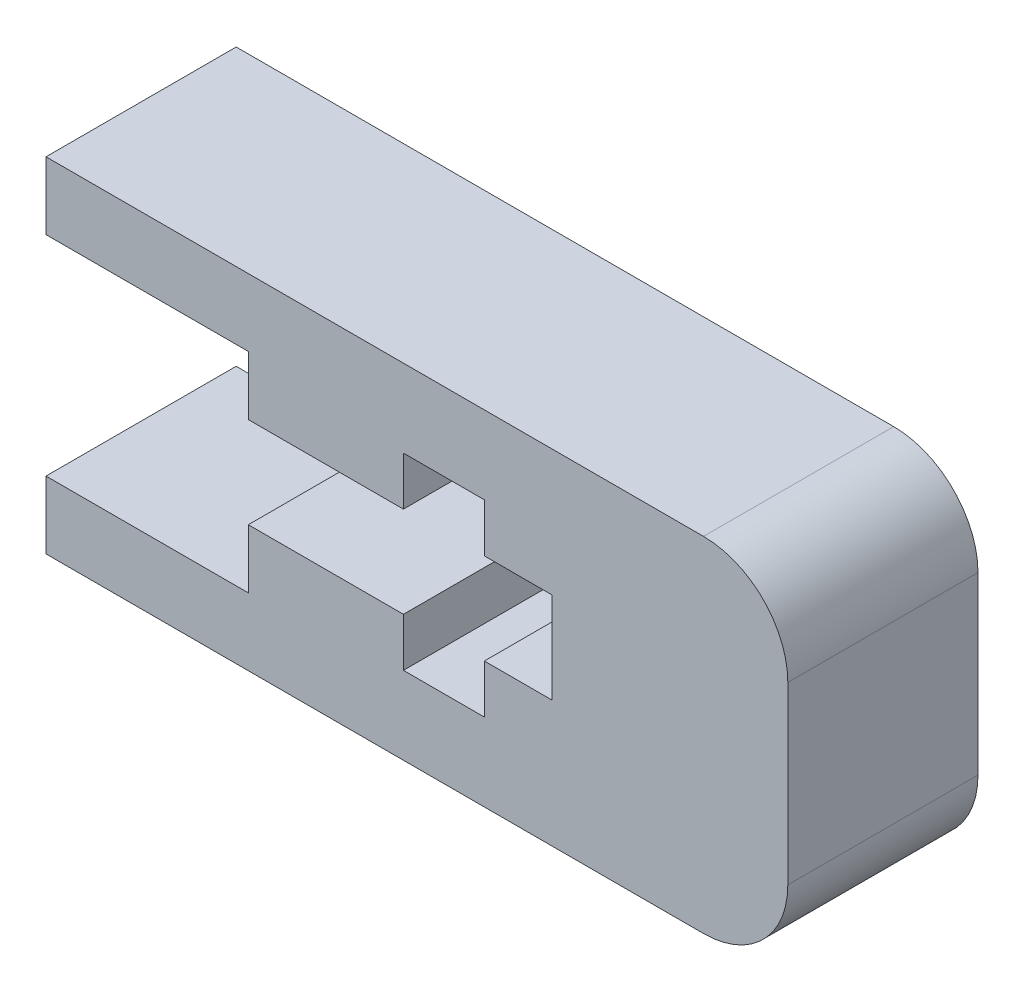
ISO-10303-21;
HEADER;
FILE_DESCRIPTION(('STEP AP214'),'2;1');
FILE_NAME('part.step','',(''),(''),'','','');
FILE_SCHEMA(('AUTOMOTIVE_DESIGN { 1 0 10303 214 1 1 1 1 }'));
ENDSEC;
DATA;
#1=APPLICATION_CONTEXT('core data for automotive mechanical design processes');
#2=APPLICATION_PROTOCOL_DEFINITION('international standard','automotive_design',2000,#1);
#3=PRODUCT_CONTEXT('',#1,'mechanical');
#4=PRODUCT('Part','Part','',(#3));
#5=PRODUCT_RELATED_PRODUCT_CATEGORY('part','',(#4));
#6=PRODUCT_DEFINITION_FORMATION('','',#4);
#7=PRODUCT_DEFINITION_CONTEXT('part definition',#1,'design');
#8=PRODUCT_DEFINITION('design','',#6,#7);
#9=PRODUCT_DEFINITION_SHAPE('','',#8);
#10=(LENGTH_UNIT() NAMED_UNIT(*) SI_UNIT(.MILLI.,.METRE.));
#11=(NAMED_UNIT(*) PLANE_ANGLE_UNIT() SI_UNIT($,.RADIAN.));
#12=(NAMED_UNIT(*) SI_UNIT($,.STERADIAN.) SOLID_ANGLE_UNIT());
#13=UNCERTAINTY_MEASURE_WITH_UNIT(LENGTH_MEASURE(1.E-05),#10,'distance_accuracy_value','');
#14=(GEOMETRIC_REPRESENTATION_CONTEXT(3) GLOBAL_UNCERTAINTY_ASSIGNED_CONTEXT((#13)) GLOBAL_UNIT_ASSIGNED_CONTEXT((#10,
#11,#12)) REPRESENTATION_CONTEXT('',''));
#15=CARTESIAN_POINT('',(0.,0.,0.));
#16=DIRECTION('',(0.,0.,1.));
#17=DIRECTION('',(1.,0.,0.));
#18=AXIS2_PLACEMENT_3D('',#15,#16,#17);
#19=CARTESIAN_POINT('',(733.339448149884,348.756300381642,5.64));
#20=DIRECTION('',(1.,0.,0.));
#21=DIRECTION('',(0.,0.,-1.));
#22=AXIS2_PLACEMENT_3D('',#19,#20,#21);
#23=PLANE('',#22);
#24=DIRECTION('',(0.,-1.,0.));
#25=VECTOR('',#24,1.);
#26=CARTESIAN_POINT('',(733.339448149884,348.756300381642,0.));
#27=LINE('',#26,#25);
#28=CARTESIAN_POINT('',(733.339448149884,348.756300381642,0.));
#29=VERTEX_POINT('',#28);
#30=CARTESIAN_POINT('',(733.339448149884,347.006300381642,0.));
#31=VERTEX_POINT('',#30);
#32=EDGE_CURVE('E206',#29,#31,#27,.T.);
#33=ORIENTED_EDGE('',*,*,#32,.T.);
#34=DIRECTION('',(0.,0.,-1.));
#35=VECTOR('',#34,1.);
#36=CARTESIAN_POINT('',(733.339448149884,347.006300381642,5.64));
#37=LINE('',#36,#35);
#38=CARTESIAN_POINT('',(733.339448149884,347.006300381642,5.64));
#39=VERTEX_POINT('',#38);
#40=EDGE_CURVE('E188',#39,#31,#37,.T.);
#41=ORIENTED_EDGE('',*,*,#40,.F.);
#42=DIRECTION('',(0.,-1.,0.));
#43=VECTOR('',#42,1.);
#44=CARTESIAN_POINT('',(733.339448149884,348.756300381642,5.64));
#45=LINE('',#44,#43);
#46=CARTESIAN_POINT('',(733.339448149884,348.756300381642,5.64));
#47=VERTEX_POINT('',#46);
#48=EDGE_CURVE('E194',#47,#39,#45,.T.);
#49=ORIENTED_EDGE('',*,*,#48,.F.);
#50=DIRECTION('',(0.,0.,-1.));
#51=VECTOR('',#50,1.);
#52=CARTESIAN_POINT('',(733.339448149884,348.756300381642,5.64));
#53=LINE('',#52,#51);
#54=EDGE_CURVE('E258',#47,#29,#53,.T.);
#55=ORIENTED_EDGE('',*,*,#54,.T.);
#56=EDGE_LOOP('',(#33,#41,#49,#55));
#57=FACE_BOUND('',#56,.T.);
#58=ADVANCED_FACE('F32',(#57),#23,.F.);
#59=CARTESIAN_POINT('',(733.339448149884,347.006300381642,5.64));
#60=DIRECTION('',(0.,1.,0.));
#61=DIRECTION('',(0.,0.,1.));
#62=AXIS2_PLACEMENT_3D('',#59,#60,#61);
#63=PLANE('',#62);
#64=DIRECTION('',(1.,0.,0.));
#65=VECTOR('',#64,1.);
#66=CARTESIAN_POINT('',(733.339448149884,347.006300381642,0.));
#67=LINE('',#66,#65);
#68=CARTESIAN_POINT('',(737.939448149884,347.006300381642,0.));
#69=VERTEX_POINT('',#68);
#70=EDGE_CURVE('E317',#31,#69,#67,.T.);
#71=ORIENTED_EDGE('',*,*,#70,.T.);
#72=DIRECTION('',(0.,0.,-1.));
#73=VECTOR('',#72,1.);
#74=CARTESIAN_POINT('',(737.939448149884,347.006300381642,5.64));
#75=LINE('',#74,#73);
#76=CARTESIAN_POINT('',(737.939448149884,347.006300381642,5.64));
#77=VERTEX_POINT('',#76);
#78=EDGE_CURVE('E191',#77,#69,#75,.T.);
#79=ORIENTED_EDGE('',*,*,#78,.F.);
#80=DIRECTION('',(1.,0.,0.));
#81=VECTOR('',#80,1.);
#82=CARTESIAN_POINT('',(733.339448149884,347.006300381642,5.64));
#83=LINE('',#82,#81);
#84=EDGE_CURVE('E184',#39,#77,#83,.T.);
#85=ORIENTED_EDGE('',*,*,#84,.F.);
#86=ORIENTED_EDGE('',*,*,#40,.T.);
#87=EDGE_LOOP('',(#71,#79,#85,#86));
#88=FACE_BOUND('',#87,.T.);
#89=ADVANCED_FACE('F186',(#88),#63,.F.);
#90=CARTESIAN_POINT('',(737.939448149884,347.006300381642,5.64));
#91=DIRECTION('',(-1.,0.,0.));
#92=DIRECTION('',(0.,0.,1.));
#93=AXIS2_PLACEMENT_3D('',#90,#91,#92);
#94=PLANE('',#93);
#95=DIRECTION('',(0.,1.,0.));
#96=VECTOR('',#95,1.);
#97=CARTESIAN_POINT('',(737.939448149884,347.006300381642,0.));
#98=LINE('',#97,#96);
#99=CARTESIAN_POINT('',(737.939448149884,348.446300381642,0.));
#100=VERTEX_POINT('',#99);
#101=EDGE_CURVE('E311',#69,#100,#98,.T.);
#102=ORIENTED_EDGE('',*,*,#101,.T.);
#103=DIRECTION('',(0.,0.,-1.));
#104=VECTOR('',#103,1.);
#105=CARTESIAN_POINT('',(737.939448149884,348.446300381642,5.64));
#106=LINE('',#105,#104);
#107=CARTESIAN_POINT('',(737.939448149884,348.446300381642,5.64));
#108=VERTEX_POINT('',#107);
#109=EDGE_CURVE('E211',#108,#100,#106,.T.);
#110=ORIENTED_EDGE('',*,*,#109,.F.);
#111=DIRECTION('',(0.,1.,0.));
#112=VECTOR('',#111,1.);
#113=CARTESIAN_POINT('',(737.939448149884,347.006300381642,5.64));
#114=LINE('',#113,#112);
#115=EDGE_CURVE('E193',#77,#108,#114,.T.);
#116=ORIENTED_EDGE('',*,*,#115,.F.);
#117=ORIENTED_EDGE('',*,*,#78,.T.);
#118=EDGE_LOOP('',(#102,#110,#116,#117));
#119=FACE_BOUND('',#118,.T.);
#120=ADVANCED_FACE('F357',(#119),#94,.F.);
#121=CARTESIAN_POINT('',(737.939448149884,348.446300381642,5.64));
#122=DIRECTION('',(0.,1.,0.));
#123=DIRECTION('',(0.,0.,1.));
#124=AXIS2_PLACEMENT_3D('',#121,#122,#123);
#125=PLANE('',#124);
#126=DIRECTION('',(1.,0.,0.));
#127=VECTOR('',#126,1.);
#128=CARTESIAN_POINT('',(737.939448149884,348.446300381642,0.));
#129=LINE('',#128,#127);
#130=CARTESIAN_POINT('',(740.339448149884,348.446300381642,0.));
#131=VERTEX_POINT('',#130);
#132=EDGE_CURVE('E306',#100,#131,#129,.T.);
#133=ORIENTED_EDGE('',*,*,#132,.T.);
#134=DIRECTION('',(0.,0.,-1.));
#135=VECTOR('',#134,1.);
#136=CARTESIAN_POINT('',(740.339448149884,348.446300381642,5.64));
#137=LINE('',#136,#135);
#138=CARTESIAN_POINT('',(740.339448149884,348.446300381642,5.64));
#139=VERTEX_POINT('',#138);
#140=EDGE_CURVE('E297',#139,#131,#137,.T.);
#141=ORIENTED_EDGE('',*,*,#140,.F.);
#142=DIRECTION('',(1.,0.,0.));
#143=VECTOR('',#142,1.);
#144=CARTESIAN_POINT('',(737.939448149884,348.446300381642,5.64));
#145=LINE('',#144,#143);
#146=EDGE_CURVE('E307',#108,#139,#145,.T.);
#147=ORIENTED_EDGE('',*,*,#146,.F.);
#148=ORIENTED_EDGE('',*,*,#109,.T.);
#149=EDGE_LOOP('',(#133,#141,#147,#148));
#150=FACE_BOUND('',#149,.T.);
#151=ADVANCED_FACE('F304',(#150),#125,.F.);
#152=CARTESIAN_POINT('',(740.339448149884,348.446300381642,5.64));
#153=DIRECTION('',(1.,0.,0.));
#154=DIRECTION('',(0.,0.,-1.));
#155=AXIS2_PLACEMENT_3D('',#152,#153,#154);
#156=PLANE('',#155);
#157=DIRECTION('',(0.,-1.,0.));
#158=VECTOR('',#157,1.);
#159=CARTESIAN_POINT('',(740.339448149884,348.446300381642,0.));
#160=LINE('',#159,#158);
#161=CARTESIAN_POINT('',(740.339448149884,347.006300381642,0.));
#162=VERTEX_POINT('',#161);
#163=EDGE_CURVE('E313',#131,#162,#160,.T.);
#164=ORIENTED_EDGE('',*,*,#163,.T.);
#165=DIRECTION('',(0.,0.,-1.));
#166=VECTOR('',#165,1.);
#167=CARTESIAN_POINT('',(740.339448149884,347.006300381642,5.64));
#168=LINE('',#167,#166);
#169=CARTESIAN_POINT('',(740.339448149884,347.006300381642,5.64));
#170=VERTEX_POINT('',#169);
#171=EDGE_CURVE('E294',#170,#162,#168,.T.);
#172=ORIENTED_EDGE('',*,*,#171,.F.);
#173=DIRECTION('',(0.,-1.,0.));
#174=VECTOR('',#173,1.);
#175=CARTESIAN_POINT('',(740.339448149884,348.446300381642,5.64));
#176=LINE('',#175,#174);
#177=EDGE_CURVE('E359',#139,#170,#176,.T.);
#178=ORIENTED_EDGE('',*,*,#177,.F.);
#179=ORIENTED_EDGE('',*,*,#140,.T.);
#180=EDGE_LOOP('',(#164,#172,#178,#179));
#181=FACE_BOUND('',#180,.T.);
#182=ADVANCED_FACE('F416',(#181),#156,.F.);
#183=CARTESIAN_POINT('',(740.339448149884,347.006300381642,5.64));
#184=DIRECTION('',(0.,1.,0.));
#185=DIRECTION('',(-1.,0.,0.));
#186=AXIS2_PLACEMENT_3D('',#183,#184,#185);
#187=PLANE('',#186);
#188=DIRECTION('',(1.,0.,0.));
#189=VECTOR('',#188,1.);
#190=CARTESIAN_POINT('',(740.339448149884,347.006300381642,0.));
#191=LINE('',#190,#189);
#192=CARTESIAN_POINT('',(742.339448149884,347.006300381642,0.));
#193=VERTEX_POINT('',#192);
#194=EDGE_CURVE('E315',#162,#193,#191,.T.);
#195=ORIENTED_EDGE('',*,*,#194,.T.);
#196=DIRECTION('',(0.,0.,-1.));
#197=VECTOR('',#196,1.);
#198=CARTESIAN_POINT('',(742.339448149884,347.006300381642,5.64));
#199=LINE('',#198,#197);
#200=CARTESIAN_POINT('',(742.339448149884,347.006300381642,5.64));
#201=VERTEX_POINT('',#200);
#202=EDGE_CURVE('E291',#201,#193,#199,.T.);
#203=ORIENTED_EDGE('',*,*,#202,.F.);
#204=DIRECTION('',(1.,0.,0.));
#205=VECTOR('',#204,1.);
#206=CARTESIAN_POINT('',(740.339448149884,347.006300381642,5.64));
#207=LINE('',#206,#205);
#208=EDGE_CURVE('E363',#170,#201,#207,.T.);
#209=ORIENTED_EDGE('',*,*,#208,.F.);
#210=ORIENTED_EDGE('',*,*,#171,.T.);
#211=EDGE_LOOP('',(#195,#203,#209,#210));
#212=FACE_BOUND('',#211,.T.);
#213=ADVANCED_FACE('F411',(#212),#187,.F.);
#214=CARTESIAN_POINT('',(742.339448149884,347.006300381642,5.64));
#215=DIRECTION('',(1.,0.,0.));
#216=DIRECTION('',(0.,0.,-1.));
#217=AXIS2_PLACEMENT_3D('',#214,#215,#216);
#218=PLANE('',#217);
#219=DIRECTION('',(0.,-1.,0.));
#220=VECTOR('',#219,1.);
#221=CARTESIAN_POINT('',(742.339448149884,347.006300381642,0.));
#222=LINE('',#221,#220);
#223=CARTESIAN_POINT('',(742.339448149884,344.306300381642,0.));
#224=VERTEX_POINT('',#223);
#225=EDGE_CURVE('E322',#193,#224,#222,.T.);
#226=ORIENTED_EDGE('',*,*,#225,.T.);
#227=DIRECTION('',(0.,0.,-1.));
#228=VECTOR('',#227,1.);
#229=CARTESIAN_POINT('',(742.339448149884,344.306300381642,5.64));
#230=LINE('',#229,#228);
#231=CARTESIAN_POINT('',(742.339448149884,344.306300381642,5.64));
#232=VERTEX_POINT('',#231);
#233=EDGE_CURVE('E288',#232,#224,#230,.T.);
#234=ORIENTED_EDGE('',*,*,#233,.F.);
#235=DIRECTION('',(0.,-1.,0.));
#236=VECTOR('',#235,1.);
#237=CARTESIAN_POINT('',(742.339448149884,347.006300381642,5.64));
#238=LINE('',#237,#236);
#239=EDGE_CURVE('E365',#201,#232,#238,.T.);
#240=ORIENTED_EDGE('',*,*,#239,.F.);
#241=ORIENTED_EDGE('',*,*,#202,.T.);
#242=EDGE_LOOP('',(#226,#234,#240,#241));
#243=FACE_BOUND('',#242,.T.);
#244=ADVANCED_FACE('F408',(#243),#218,.F.);
#245=CARTESIAN_POINT('',(740.339448149884,344.306300381642,5.64));
#246=DIRECTION('',(0.,-1.,0.));
#247=DIRECTION('',(0.,0.,-1.));
#248=AXIS2_PLACEMENT_3D('',#245,#246,#247);
#249=PLANE('',#248);
#250=DIRECTION('',(-1.,0.,0.));
#251=VECTOR('',#250,1.);
#252=CARTESIAN_POINT('',(740.339448149884,344.306300381642,0.));
#253=LINE('',#252,#251);
#254=CARTESIAN_POINT('',(740.339448149884,344.306300381642,0.));
#255=VERTEX_POINT('',#254);
#256=EDGE_CURVE('E324',#224,#255,#253,.T.);
#257=ORIENTED_EDGE('',*,*,#256,.T.);
#258=DIRECTION('',(0.,0.,-1.));
#259=VECTOR('',#258,1.);
#260=CARTESIAN_POINT('',(740.339448149884,344.306300381642,5.64));
#261=LINE('',#260,#259);
#262=CARTESIAN_POINT('',(740.339448149884,344.306300381642,5.64));
#263=VERTEX_POINT('',#262);
#264=EDGE_CURVE('E285',#263,#255,#261,.T.);
#265=ORIENTED_EDGE('',*,*,#264,.F.);
#266=DIRECTION('',(-1.,0.,0.));
#267=VECTOR('',#266,1.);
#268=CARTESIAN_POINT('',(740.339448149884,344.306300381642,5.64));
#269=LINE('',#268,#267);
#270=EDGE_CURVE('E367',#232,#263,#269,.T.);
#271=ORIENTED_EDGE('',*,*,#270,.F.);
#272=ORIENTED_EDGE('',*,*,#233,.T.);
#273=EDGE_LOOP('',(#257,#265,#271,#272));
#274=FACE_BOUND('',#273,.T.);
#275=ADVANCED_FACE('F404',(#274),#249,.F.);
#276=CARTESIAN_POINT('',(740.339448149884,342.866300381642,5.64));
#277=DIRECTION('',(1.,0.,0.));
#278=DIRECTION('',(0.,0.,-1.));
#279=AXIS2_PLACEMENT_3D('',#276,#277,#278);
#280=PLANE('',#279);
#281=DIRECTION('',(0.,-1.,0.));
#282=VECTOR('',#281,1.);
#283=CARTESIAN_POINT('',(740.339448149884,342.866300381642,0.));
#284=LINE('',#283,#282);
#285=CARTESIAN_POINT('',(740.339448149884,342.866300381642,0.));
#286=VERTEX_POINT('',#285);
#287=EDGE_CURVE('E326',#255,#286,#284,.T.);
#288=ORIENTED_EDGE('',*,*,#287,.T.);
#289=DIRECTION('',(0.,0.,-1.));
#290=VECTOR('',#289,1.);
#291=CARTESIAN_POINT('',(740.339448149884,342.866300381642,5.64));
#292=LINE('',#291,#290);
#293=CARTESIAN_POINT('',(740.339448149884,342.866300381642,5.64));
#294=VERTEX_POINT('',#293);
#295=EDGE_CURVE('E282',#294,#286,#292,.T.);
#296=ORIENTED_EDGE('',*,*,#295,.F.);
#297=DIRECTION('',(0.,-1.,0.));
#298=VECTOR('',#297,1.);
#299=CARTESIAN_POINT('',(740.339448149884,342.866300381642,5.64));
#300=LINE('',#299,#298);
#301=EDGE_CURVE('E369',#263,#294,#300,.T.);
#302=ORIENTED_EDGE('',*,*,#301,.F.);
#303=ORIENTED_EDGE('',*,*,#264,.T.);
#304=EDGE_LOOP('',(#288,#296,#302,#303));
#305=FACE_BOUND('',#304,.T.);
#306=ADVANCED_FACE('F399',(#305),#280,.F.);
#307=CARTESIAN_POINT('',(737.939448149884,342.866300381642,5.64));
#308=DIRECTION('',(0.,-1.,0.));
#309=DIRECTION('',(0.,0.,-1.));
#310=AXIS2_PLACEMENT_3D('',#307,#308,#309);
#311=PLANE('',#310);
#312=DIRECTION('',(-1.,0.,0.));
#313=VECTOR('',#312,1.);
#314=CARTESIAN_POINT('',(737.939448149884,342.866300381642,0.));
#315=LINE('',#314,#313);
#316=CARTESIAN_POINT('',(737.939448149884,342.866300381642,0.));
#317=VERTEX_POINT('',#316);
#318=EDGE_CURVE('E328',#286,#317,#315,.T.);
#319=ORIENTED_EDGE('',*,*,#318,.T.);
#320=DIRECTION('',(0.,0.,-1.));
#321=VECTOR('',#320,1.);
#322=CARTESIAN_POINT('',(737.939448149884,342.866300381642,5.64));
#323=LINE('',#322,#321);
#324=CARTESIAN_POINT('',(737.939448149884,342.866300381642,5.64));
#325=VERTEX_POINT('',#324);
#326=EDGE_CURVE('E279',#325,#317,#323,.T.);
#327=ORIENTED_EDGE('',*,*,#326,.F.);
#328=DIRECTION('',(-1.,0.,0.));
#329=VECTOR('',#328,1.);
#330=CARTESIAN_POINT('',(737.939448149884,342.866300381642,5.64));
#331=LINE('',#330,#329);
#332=EDGE_CURVE('E371',#294,#325,#331,.T.);
#333=ORIENTED_EDGE('',*,*,#332,.F.);
#334=ORIENTED_EDGE('',*,*,#295,.T.);
#335=EDGE_LOOP('',(#319,#327,#333,#334));
#336=FACE_BOUND('',#335,.T.);
#337=ADVANCED_FACE('F393',(#336),#311,.F.);
#338=CARTESIAN_POINT('',(737.939448149884,344.306300381642,5.64));
#339=DIRECTION('',(-1.,0.,0.));
#340=DIRECTION('',(0.,0.,1.));
#341=AXIS2_PLACEMENT_3D('',#338,#339,#340);
#342=PLANE('',#341);
#343=DIRECTION('',(0.,1.,0.));
#344=VECTOR('',#343,1.);
#345=CARTESIAN_POINT('',(737.939448149884,344.306300381642,0.));
#346=LINE('',#345,#344);
#347=CARTESIAN_POINT('',(737.939448149884,344.306300381642,0.));
#348=VERTEX_POINT('',#347);
#349=EDGE_CURVE('E330',#317,#348,#346,.T.);
#350=ORIENTED_EDGE('',*,*,#349,.T.);
#351=DIRECTION('',(0.,0.,-1.));
#352=VECTOR('',#351,1.);
#353=CARTESIAN_POINT('',(737.939448149884,344.306300381642,5.64));
#354=LINE('',#353,#352);
#355=CARTESIAN_POINT('',(737.939448149884,344.306300381642,5.64));
#356=VERTEX_POINT('',#355);
#357=EDGE_CURVE('E276',#356,#348,#354,.T.);
#358=ORIENTED_EDGE('',*,*,#357,.F.);
#359=DIRECTION('',(0.,1.,0.));
#360=VECTOR('',#359,1.);
#361=CARTESIAN_POINT('',(737.939448149884,344.306300381642,5.64));
#362=LINE('',#361,#360);
#363=EDGE_CURVE('E373',#325,#356,#362,.T.);
#364=ORIENTED_EDGE('',*,*,#363,.F.);
#365=ORIENTED_EDGE('',*,*,#326,.T.);
#366=EDGE_LOOP('',(#350,#358,#364,#365));
#367=FACE_BOUND('',#366,.T.);
#368=ADVANCED_FACE('F389',(#367),#342,.F.);
#369=CARTESIAN_POINT('',(733.339448149884,344.306300381642,5.64));
#370=DIRECTION('',(0.,-1.,0.));
#371=DIRECTION('',(0.,0.,-1.));
#372=AXIS2_PLACEMENT_3D('',#369,#370,#371);
#373=PLANE('',#372);
#374=DIRECTION('',(-1.,0.,0.));
#375=VECTOR('',#374,1.);
#376=CARTESIAN_POINT('',(733.339448149884,344.306300381642,0.));
#377=LINE('',#376,#375);
#378=CARTESIAN_POINT('',(733.339448149884,344.306300381642,0.));
#379=VERTEX_POINT('',#378);
#380=EDGE_CURVE('E332',#348,#379,#377,.T.);
#381=ORIENTED_EDGE('',*,*,#380,.T.);
#382=DIRECTION('',(0.,0.,-1.));
#383=VECTOR('',#382,1.);
#384=CARTESIAN_POINT('',(733.339448149884,344.306300381642,5.64));
#385=LINE('',#384,#383);
#386=CARTESIAN_POINT('',(733.339448149884,344.306300381642,5.64));
#387=VERTEX_POINT('',#386);
#388=EDGE_CURVE('E273',#387,#379,#385,.T.);
#389=ORIENTED_EDGE('',*,*,#388,.F.);
#390=DIRECTION('',(-1.,0.,0.));
#391=VECTOR('',#390,1.);
#392=CARTESIAN_POINT('',(733.339448149884,344.306300381642,5.64));
#393=LINE('',#392,#391);
#394=EDGE_CURVE('E375',#356,#387,#393,.T.);
#395=ORIENTED_EDGE('',*,*,#394,.F.);
#396=ORIENTED_EDGE('',*,*,#357,.T.);
#397=EDGE_LOOP('',(#381,#389,#395,#396));
#398=FACE_BOUND('',#397,.T.);
#399=ADVANCED_FACE('F385',(#398),#373,.F.);
#400=CARTESIAN_POINT('',(733.339448149884,342.556300381642,5.64));
#401=DIRECTION('',(1.,0.,0.));
#402=DIRECTION('',(0.,0.,-1.));
#403=AXIS2_PLACEMENT_3D('',#400,#401,#402);
#404=PLANE('',#403);
#405=DIRECTION('',(0.,-1.,0.));
#406=VECTOR('',#405,1.);
#407=CARTESIAN_POINT('',(733.339448149884,342.556300381642,0.));
#408=LINE('',#407,#406);
#409=CARTESIAN_POINT('',(733.339448149884,342.556300381642,0.));
#410=VERTEX_POINT('',#409);
#411=EDGE_CURVE('E334',#379,#410,#408,.T.);
#412=ORIENTED_EDGE('',*,*,#411,.T.);
#413=DIRECTION('',(0.,0.,-1.));
#414=VECTOR('',#413,1.);
#415=CARTESIAN_POINT('',(733.339448149884,342.556300381642,5.64));
#416=LINE('',#415,#414);
#417=CARTESIAN_POINT('',(733.339448149884,342.556300381642,5.64));
#418=VERTEX_POINT('',#417);
#419=EDGE_CURVE('E270',#418,#410,#416,.T.);
#420=ORIENTED_EDGE('',*,*,#419,.F.);
#421=DIRECTION('',(0.,-1.,0.));
#422=VECTOR('',#421,1.);
#423=CARTESIAN_POINT('',(733.339448149884,342.556300381642,5.64));
#424=LINE('',#423,#422);
#425=EDGE_CURVE('E349',#387,#418,#424,.T.);
#426=ORIENTED_EDGE('',*,*,#425,.F.);
#427=ORIENTED_EDGE('',*,*,#388,.T.);
#428=EDGE_LOOP('',(#412,#420,#426,#427));
#429=FACE_BOUND('',#428,.T.);
#430=ADVANCED_FACE('F380',(#429),#404,.F.);
#431=CARTESIAN_POINT('',(727.339448149884,342.556300381642,5.64));
#432=DIRECTION('',(0.,-1.,0.));
#433=DIRECTION('',(1.,0.,0.));
#434=AXIS2_PLACEMENT_3D('',#431,#432,#433);
#435=PLANE('',#434);
#436=DIRECTION('',(-1.,0.,0.));
#437=VECTOR('',#436,1.);
#438=CARTESIAN_POINT('',(727.339448149884,342.556300381642,0.));
#439=LINE('',#438,#437);
#440=CARTESIAN_POINT('',(727.339448149884,342.556300381642,0.));
#441=VERTEX_POINT('',#440);
#442=EDGE_CURVE('E250',#410,#441,#439,.T.);
#443=ORIENTED_EDGE('',*,*,#442,.T.);
#444=DIRECTION('',(0.,0.,-1.));
#445=VECTOR('',#444,1.);
#446=CARTESIAN_POINT('',(727.339448149884,342.556300381642,5.64));
#447=LINE('',#446,#445);
#448=CARTESIAN_POINT('',(727.339448149884,342.556300381642,5.64));
#449=VERTEX_POINT('',#448);
#450=EDGE_CURVE('E267',#449,#441,#447,.T.);
#451=ORIENTED_EDGE('',*,*,#450,.F.);
#452=DIRECTION('',(-1.,0.,0.));
#453=VECTOR('',#452,1.);
#454=CARTESIAN_POINT('',(727.339448149884,342.556300381642,5.64));
#455=LINE('',#454,#453);
#456=EDGE_CURVE('E346',#418,#449,#455,.T.);
#457=ORIENTED_EDGE('',*,*,#456,.F.);
#458=ORIENTED_EDGE('',*,*,#419,.T.);
#459=EDGE_LOOP('',(#443,#451,#457,#458));
#460=FACE_BOUND('',#459,.T.);
#461=ADVANCED_FACE('F338',(#460),#435,.F.);
#462=CARTESIAN_POINT('',(727.339448149884,340.556300381642,5.64));
#463=DIRECTION('',(1.,0.,0.));
#464=DIRECTION('',(0.,0.,-1.));
#465=AXIS2_PLACEMENT_3D('',#462,#463,#464);
#466=PLANE('',#465);
#467=DIRECTION('',(0.,-1.,0.));
#468=VECTOR('',#467,1.);
#469=CARTESIAN_POINT('',(727.339448149884,340.556300381642,0.));
#470=LINE('',#469,#468);
#471=CARTESIAN_POINT('',(727.339448149884,340.556300381642,0.));
#472=VERTEX_POINT('',#471);
#473=EDGE_CURVE('E246',#441,#472,#470,.T.);
#474=ORIENTED_EDGE('',*,*,#473,.T.);
#475=DIRECTION('',(0.,0.,-1.));
#476=VECTOR('',#475,1.);
#477=CARTESIAN_POINT('',(727.339448149884,340.556300381642,5.64));
#478=LINE('',#477,#476);
#479=CARTESIAN_POINT('',(727.339448149884,340.556300381642,5.64));
#480=VERTEX_POINT('',#479);
#481=EDGE_CURVE('E245',#480,#472,#478,.T.);
#482=ORIENTED_EDGE('',*,*,#481,.F.);
#483=DIRECTION('',(0.,-1.,0.));
#484=VECTOR('',#483,1.);
#485=CARTESIAN_POINT('',(727.339448149884,340.556300381642,5.64));
#486=LINE('',#485,#484);
#487=EDGE_CURVE('E345',#449,#480,#486,.T.);
#488=ORIENTED_EDGE('',*,*,#487,.F.);
#489=ORIENTED_EDGE('',*,*,#450,.T.);
#490=EDGE_LOOP('',(#474,#482,#488,#489));
#491=FACE_BOUND('',#490,.T.);
#492=ADVANCED_FACE('F344',(#491),#466,.F.);
#493=CARTESIAN_POINT('',(727.339448149884,340.556300381642,5.64));
#494=DIRECTION('',(0.,1.,0.));
#495=DIRECTION('',(0.,0.,1.));
#496=AXIS2_PLACEMENT_3D('',#493,#494,#495);
#497=PLANE('',#496);
#498=DIRECTION('',(1.,0.,0.));
#499=VECTOR('',#498,1.);
#500=CARTESIAN_POINT('',(727.339448149884,340.556300381642,0.));
#501=LINE('',#500,#499);
#502=CARTESIAN_POINT('',(746.839448149884,340.556300381642,0.));
#503=VERTEX_POINT('',#502);
#504=EDGE_CURVE('E240',#472,#503,#501,.T.);
#505=ORIENTED_EDGE('',*,*,#504,.T.);
#506=DIRECTION('',(0.,0.,-1.));
#507=VECTOR('',#506,1.);
#508=CARTESIAN_POINT('',(746.839448149884,340.556300381642,5.64));
#509=LINE('',#508,#507);
#510=CARTESIAN_POINT('',(746.839448149884,340.556300381642,5.64));
#511=VERTEX_POINT('',#510);
#512=EDGE_CURVE('E55',#503,#511,#509,.F.);
#513=ORIENTED_EDGE('',*,*,#512,.T.);
#514=DIRECTION('',(1.,0.,0.));
#515=VECTOR('',#514,1.);
#516=CARTESIAN_POINT('',(727.339448149884,340.556300381642,5.64));
#517=LINE('',#516,#515);
#518=EDGE_CURVE('E225',#480,#511,#517,.T.);
#519=ORIENTED_EDGE('',*,*,#518,.F.);
#520=ORIENTED_EDGE('',*,*,#481,.T.);
#521=EDGE_LOOP('',(#505,#513,#519,#520));
#522=FACE_BOUND('',#521,.T.);
#523=ADVANCED_FACE('F243',(#522),#497,.F.);
#524=CARTESIAN_POINT('',(749.339448149884,350.756300381642,5.64));
#525=DIRECTION('',(-1.,0.,0.));
#526=DIRECTION('',(0.,0.,1.));
#527=AXIS2_PLACEMENT_3D('',#524,#525,#526);
#528=PLANE('',#527);
#529=DIRECTION('',(0.,1.,0.));
#530=VECTOR('',#529,1.);
#531=CARTESIAN_POINT('',(749.339448149884,350.756300381642,5.64));
#532=LINE('',#531,#530);
#533=CARTESIAN_POINT('',(749.339448149884,343.056300381642,5.64));
#534=VERTEX_POINT('',#533);
#535=CARTESIAN_POINT('',(749.339448149884,348.256300381642,5.64));
#536=VERTEX_POINT('',#535);
#537=EDGE_CURVE('E224',#534,#536,#532,.T.);
#538=ORIENTED_EDGE('',*,*,#537,.F.);
#539=DIRECTION('',(0.,0.,-1.));
#540=VECTOR('',#539,1.);
#541=CARTESIAN_POINT('',(749.339448149884,343.056300381642,5.64));
#542=LINE('',#541,#540);
#543=CARTESIAN_POINT('',(749.339448149884,343.056300381642,0.));
#544=VERTEX_POINT('',#543);
#545=EDGE_CURVE('E209',#534,#544,#542,.T.);
#546=ORIENTED_EDGE('',*,*,#545,.T.);
#547=DIRECTION('',(0.,1.,0.));
#548=VECTOR('',#547,1.);
#549=CARTESIAN_POINT('',(749.339448149884,350.756300381642,0.));
#550=LINE('',#549,#548);
#551=CARTESIAN_POINT('',(749.339448149884,348.256300381642,0.));
#552=VERTEX_POINT('',#551);
#553=EDGE_CURVE('E241',#544,#552,#550,.T.);
#554=ORIENTED_EDGE('',*,*,#553,.T.);
#555=DIRECTION('',(0.,0.,-1.));
#556=VECTOR('',#555,1.);
#557=CARTESIAN_POINT('',(749.339448149884,348.256300381642,5.64));
#558=LINE('',#557,#556);
#559=EDGE_CURVE('E207',#552,#536,#558,.F.);
#560=ORIENTED_EDGE('',*,*,#559,.T.);
#561=EDGE_LOOP('',(#538,#546,#554,#560));
#562=FACE_BOUND('',#561,.T.);
#563=ADVANCED_FACE('F229',(#562),#528,.F.);
#564=CARTESIAN_POINT('',(727.339448149884,350.756300381642,5.64));
#565=DIRECTION('',(0.,-1.,0.));
#566=DIRECTION('',(0.,0.,-1.));
#567=AXIS2_PLACEMENT_3D('',#564,#565,#566);
#568=PLANE('',#567);
#569=DIRECTION('',(-1.,0.,0.));
#570=VECTOR('',#569,1.);
#571=CARTESIAN_POINT('',(727.339448149884,350.756300381642,5.64));
#572=LINE('',#571,#570);
#573=CARTESIAN_POINT('',(746.839448149884,350.756300381642,5.64));
#574=VERTEX_POINT('',#573);
#575=CARTESIAN_POINT('',(727.339448149884,350.756300381642,5.64));
#576=VERTEX_POINT('',#575);
#577=EDGE_CURVE('E233',#574,#576,#572,.T.);
#578=ORIENTED_EDGE('',*,*,#577,.F.);
#579=DIRECTION('',(0.,0.,-1.));
#580=VECTOR('',#579,1.);
#581=CARTESIAN_POINT('',(746.839448149884,350.756300381642,5.64));
#582=LINE('',#581,#580);
#583=CARTESIAN_POINT('',(746.839448149884,350.756300381642,0.));
#584=VERTEX_POINT('',#583);
#585=EDGE_CURVE('E11',#574,#584,#582,.T.);
#586=ORIENTED_EDGE('',*,*,#585,.T.);
#587=DIRECTION('',(-1.,0.,0.));
#588=VECTOR('',#587,1.);
#589=CARTESIAN_POINT('',(727.339448149884,350.756300381642,0.));
#590=LINE('',#589,#588);
#591=CARTESIAN_POINT('',(727.339448149884,350.756300381642,0.));
#592=VERTEX_POINT('',#591);
#593=EDGE_CURVE('E248',#584,#592,#590,.T.);
#594=ORIENTED_EDGE('',*,*,#593,.T.);
#595=DIRECTION('',(0.,0.,-1.));
#596=VECTOR('',#595,1.);
#597=CARTESIAN_POINT('',(727.339448149884,350.756300381642,5.64));
#598=LINE('',#597,#596);
#599=EDGE_CURVE('E263',#576,#592,#598,.T.);
#600=ORIENTED_EDGE('',*,*,#599,.F.);
#601=EDGE_LOOP('',(#578,#586,#594,#600));
#602=FACE_BOUND('',#601,.T.);
#603=ADVANCED_FACE('F451',(#602),#568,.F.);
#604=CARTESIAN_POINT('',(727.339448149884,350.756300381642,5.64));
#605=DIRECTION('',(1.,0.,0.));
#606=DIRECTION('',(0.,0.,-1.));
#607=AXIS2_PLACEMENT_3D('',#604,#605,#606);
#608=PLANE('',#607);
#609=DIRECTION('',(0.,-1.,0.));
#610=VECTOR('',#609,1.);
#611=CARTESIAN_POINT('',(727.339448149884,350.756300381642,0.));
#612=LINE('',#611,#610);
#613=CARTESIAN_POINT('',(727.339448149884,348.756300381642,0.));
#614=VERTEX_POINT('',#613);
#615=EDGE_CURVE('E255',#592,#614,#612,.T.);
#616=ORIENTED_EDGE('',*,*,#615,.T.);
#617=DIRECTION('',(0.,0.,-1.));
#618=VECTOR('',#617,1.);
#619=CARTESIAN_POINT('',(727.339448149884,348.756300381642,5.64));
#620=LINE('',#619,#618);
#621=CARTESIAN_POINT('',(727.339448149884,348.756300381642,5.64));
#622=VERTEX_POINT('',#621);
#623=EDGE_CURVE('E260',#622,#614,#620,.T.);
#624=ORIENTED_EDGE('',*,*,#623,.F.);
#625=DIRECTION('',(0.,-1.,0.));
#626=VECTOR('',#625,1.);
#627=CARTESIAN_POINT('',(727.339448149884,350.756300381642,5.64));
#628=LINE('',#627,#626);
#629=EDGE_CURVE('E354',#576,#622,#628,.T.);
#630=ORIENTED_EDGE('',*,*,#629,.F.);
#631=ORIENTED_EDGE('',*,*,#599,.T.);
#632=EDGE_LOOP('',(#616,#624,#630,#631));
#633=FACE_BOUND('',#632,.T.);
#634=ADVANCED_FACE('F447',(#633),#608,.F.);
#635=CARTESIAN_POINT('',(727.339448149884,348.756300381642,5.64));
#636=DIRECTION('',(0.,1.,0.));
#637=DIRECTION('',(-1.,0.,0.));
#638=AXIS2_PLACEMENT_3D('',#635,#636,#637);
#639=PLANE('',#638);
#640=DIRECTION('',(1.,0.,0.));
#641=VECTOR('',#640,1.);
#642=CARTESIAN_POINT('',(727.339448149884,348.756300381642,0.));
#643=LINE('',#642,#641);
#644=EDGE_CURVE('E203',#614,#29,#643,.T.);
#645=ORIENTED_EDGE('',*,*,#644,.T.);
#646=ORIENTED_EDGE('',*,*,#54,.F.);
#647=DIRECTION('',(1.,0.,0.));
#648=VECTOR('',#647,1.);
#649=CARTESIAN_POINT('',(727.339448149884,348.756300381642,5.64));
#650=LINE('',#649,#648);
#651=EDGE_CURVE('E199',#622,#47,#650,.T.);
#652=ORIENTED_EDGE('',*,*,#651,.F.);
#653=ORIENTED_EDGE('',*,*,#623,.T.);
#654=EDGE_LOOP('',(#645,#646,#652,#653));
#655=FACE_BOUND('',#654,.T.);
#656=ADVANCED_FACE('F442',(#655),#639,.F.);
#657=CARTESIAN_POINT('',(733.339448149884,347.006300381642,5.64));
#658=DIRECTION('',(0.,0.,1.));
#659=DIRECTION('',(1.,0.,0.));
#660=AXIS2_PLACEMENT_3D('',#657,#658,#659);
#661=PLANE('',#660);
#662=ORIENTED_EDGE('',*,*,#518,.T.);
#663=CARTESIAN_POINT('',(746.839448149884,343.056300381642,5.64));
#664=DIRECTION('',(0.,0.,1.));
#665=DIRECTION('',(1.,0.,0.));
#666=AXIS2_PLACEMENT_3D('',#663,#664,#665);
#667=CIRCLE('',#666,2.5);
#668=EDGE_CURVE('E40',#511,#534,#667,.T.);
#669=ORIENTED_EDGE('',*,*,#668,.T.);
#670=ORIENTED_EDGE('',*,*,#537,.T.);
#671=CARTESIAN_POINT('',(746.839448149884,348.256300381642,5.64));
#672=DIRECTION('',(0.,0.,1.));
#673=DIRECTION('',(1.,0.,0.));
#674=AXIS2_PLACEMENT_3D('',#671,#672,#673);
#675=CIRCLE('',#674,2.5);
#676=EDGE_CURVE('E47',#536,#574,#675,.T.);
#677=ORIENTED_EDGE('',*,*,#676,.T.);
#678=ORIENTED_EDGE('',*,*,#577,.T.);
#679=ORIENTED_EDGE('',*,*,#629,.T.);
#680=ORIENTED_EDGE('',*,*,#651,.T.);
#681=ORIENTED_EDGE('',*,*,#48,.T.);
#682=ORIENTED_EDGE('',*,*,#84,.T.);
#683=ORIENTED_EDGE('',*,*,#115,.T.);
#684=ORIENTED_EDGE('',*,*,#146,.T.);
#685=ORIENTED_EDGE('',*,*,#177,.T.);
#686=ORIENTED_EDGE('',*,*,#208,.T.);
#687=ORIENTED_EDGE('',*,*,#239,.T.);
#688=ORIENTED_EDGE('',*,*,#270,.T.);
#689=ORIENTED_EDGE('',*,*,#301,.T.);
#690=ORIENTED_EDGE('',*,*,#332,.T.);
#691=ORIENTED_EDGE('',*,*,#363,.T.);
#692=ORIENTED_EDGE('',*,*,#394,.T.);
#693=ORIENTED_EDGE('',*,*,#425,.T.);
#694=ORIENTED_EDGE('',*,*,#456,.T.);
#695=ORIENTED_EDGE('',*,*,#487,.T.);
#696=EDGE_LOOP('',(#662,#669,#670,#677,#678,#679,#680,#681,#682,#683,#684,#685,#686,#687,#688,
#689,#690,#691,#692,#693,#694,#695));
#697=FACE_BOUND('',#696,.T.);
#698=ADVANCED_FACE('F197',(#697),#661,.T.);
#699=CARTESIAN_POINT('',(733.339448149884,347.006300381642,0.));
#700=DIRECTION('',(0.,0.,1.));
#701=DIRECTION('',(1.,0.,0.));
#702=AXIS2_PLACEMENT_3D('',#699,#700,#701);
#703=PLANE('',#702);
#704=ORIENTED_EDGE('',*,*,#553,.F.);
#705=CARTESIAN_POINT('',(746.839448149884,343.056300381642,0.));
#706=DIRECTION('',(0.,0.,1.));
#707=DIRECTION('',(1.,0.,0.));
#708=AXIS2_PLACEMENT_3D('',#705,#706,#707);
#709=CIRCLE('',#708,2.5);
#710=EDGE_CURVE('E219',#544,#503,#709,.F.);
#711=ORIENTED_EDGE('',*,*,#710,.T.);
#712=ORIENTED_EDGE('',*,*,#504,.F.);
#713=ORIENTED_EDGE('',*,*,#473,.F.);
#714=ORIENTED_EDGE('',*,*,#442,.F.);
#715=ORIENTED_EDGE('',*,*,#411,.F.);
#716=ORIENTED_EDGE('',*,*,#380,.F.);
#717=ORIENTED_EDGE('',*,*,#349,.F.);
#718=ORIENTED_EDGE('',*,*,#318,.F.);
#719=ORIENTED_EDGE('',*,*,#287,.F.);
#720=ORIENTED_EDGE('',*,*,#256,.F.);
#721=ORIENTED_EDGE('',*,*,#225,.F.);
#722=ORIENTED_EDGE('',*,*,#194,.F.);
#723=ORIENTED_EDGE('',*,*,#163,.F.);
#724=ORIENTED_EDGE('',*,*,#132,.F.);
#725=ORIENTED_EDGE('',*,*,#101,.F.);
#726=ORIENTED_EDGE('',*,*,#70,.F.);
#727=ORIENTED_EDGE('',*,*,#32,.F.);
#728=ORIENTED_EDGE('',*,*,#644,.F.);
#729=ORIENTED_EDGE('',*,*,#615,.F.);
#730=ORIENTED_EDGE('',*,*,#593,.F.);
#731=CARTESIAN_POINT('',(746.839448149884,348.256300381642,0.));
#732=DIRECTION('',(0.,0.,1.));
#733=DIRECTION('',(1.,0.,0.));
#734=AXIS2_PLACEMENT_3D('',#731,#732,#733);
#735=CIRCLE('',#734,2.5);
#736=EDGE_CURVE('E217',#584,#552,#735,.F.);
#737=ORIENTED_EDGE('',*,*,#736,.T.);
#738=EDGE_LOOP('',(#704,#711,#712,#713,#714,#715,#716,#717,#718,#719,#720,#721,#722,#723,#724,
#725,#726,#727,#728,#729,#730,#737));
#739=FACE_BOUND('',#738,.T.);
#740=ADVANCED_FACE('F238',(#739),#703,.F.);
#741=CARTESIAN_POINT('',(746.839448149884,343.056300381642,5.64));
#742=DIRECTION('',(0.,0.,-1.));
#743=DIRECTION('',(-1.,0.,0.));
#744=AXIS2_PLACEMENT_3D('',#741,#742,#743);
#745=CYLINDRICAL_SURFACE('',#744,2.5);
#746=ORIENTED_EDGE('',*,*,#668,.F.);
#747=ORIENTED_EDGE('',*,*,#512,.F.);
#748=ORIENTED_EDGE('',*,*,#710,.F.);
#749=ORIENTED_EDGE('',*,*,#545,.F.);
#750=EDGE_LOOP('',(#746,#747,#748,#749));
#751=FACE_BOUND('',#750,.T.);
#752=ADVANCED_FACE('F235',(#751),#745,.T.);
#753=CARTESIAN_POINT('',(746.839448149884,348.256300381642,5.64));
#754=DIRECTION('',(0.,0.,-1.));
#755=DIRECTION('',(-1.,0.,0.));
#756=AXIS2_PLACEMENT_3D('',#753,#754,#755);
#757=CYLINDRICAL_SURFACE('',#756,2.5);
#758=ORIENTED_EDGE('',*,*,#676,.F.);
#759=ORIENTED_EDGE('',*,*,#559,.F.);
#760=ORIENTED_EDGE('',*,*,#736,.F.);
#761=ORIENTED_EDGE('',*,*,#585,.F.);
#762=EDGE_LOOP('',(#758,#759,#760,#761));
#763=FACE_BOUND('',#762,.T.);
#764=ADVANCED_FACE('F34',(#763),#757,.T.);
#765=CLOSED_SHELL('',(#58,#89,#120,#151,#182,#213,#244,#275,#306,#337,#368,#399,#430,#461,#492,
#523,#563,#603,#634,#656,#698,#740,#752,#764));
#766=MANIFOLD_SOLID_BREP('B2',#765);
#767=ADVANCED_BREP_SHAPE_REPRESENTATION('',(#18,#766),#14);
#768=SHAPE_DEFINITION_REPRESENTATION(#9,#767);
ENDSEC;
END-ISO-10303-21;
